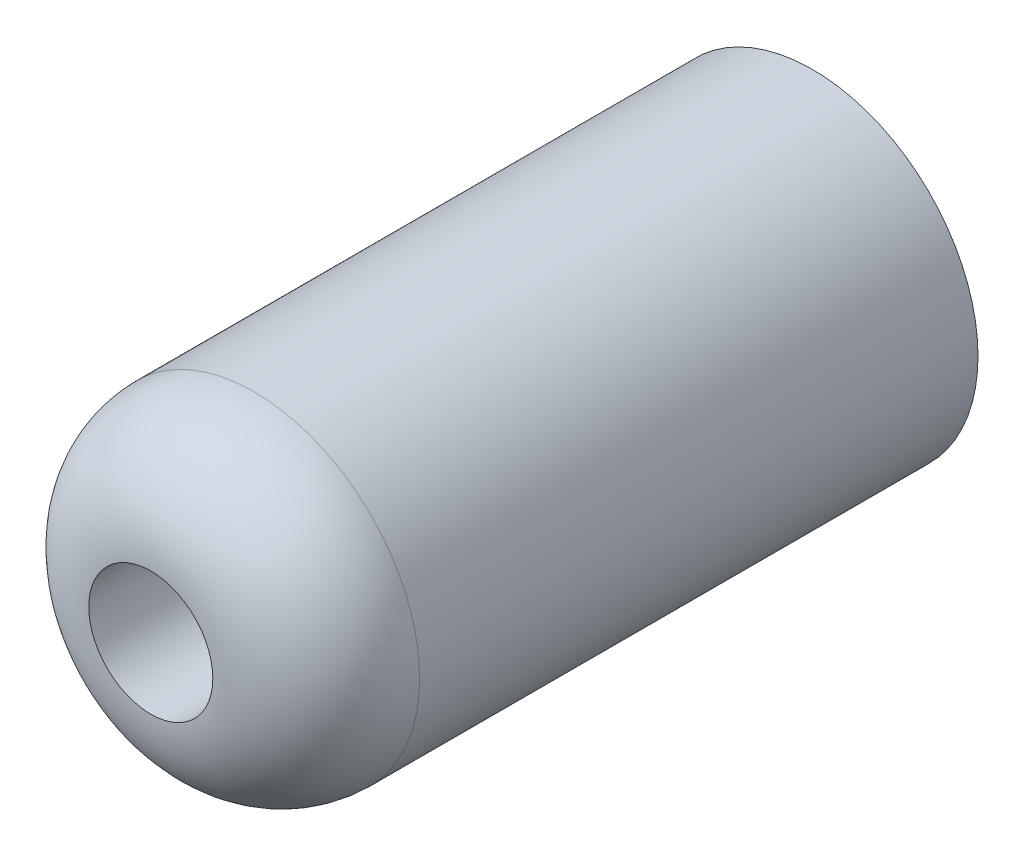
ISO-10303-21;
HEADER;
FILE_DESCRIPTION(('STEP AP214'),'2;1');
FILE_NAME('part.step','',(''),(''),'','','');
FILE_SCHEMA(('AUTOMOTIVE_DESIGN { 1 0 10303 214 1 1 1 1 }'));
ENDSEC;
DATA;
#1=APPLICATION_CONTEXT('core data for automotive mechanical design processes');
#2=APPLICATION_PROTOCOL_DEFINITION('international standard','automotive_design',2000,#1);
#3=PRODUCT_CONTEXT('',#1,'mechanical');
#4=PRODUCT('Part','Part','',(#3));
#5=PRODUCT_RELATED_PRODUCT_CATEGORY('part','',(#4));
#6=PRODUCT_DEFINITION_FORMATION('','',#4);
#7=PRODUCT_DEFINITION_CONTEXT('part definition',#1,'design');
#8=PRODUCT_DEFINITION('design','',#6,#7);
#9=PRODUCT_DEFINITION_SHAPE('','',#8);
#10=(LENGTH_UNIT() NAMED_UNIT(*) SI_UNIT(.MILLI.,.METRE.));
#11=(NAMED_UNIT(*) PLANE_ANGLE_UNIT() SI_UNIT($,.RADIAN.));
#12=(NAMED_UNIT(*) SI_UNIT($,.STERADIAN.) SOLID_ANGLE_UNIT());
#13=UNCERTAINTY_MEASURE_WITH_UNIT(LENGTH_MEASURE(1.E-05),#10,'distance_accuracy_value','');
#14=(GEOMETRIC_REPRESENTATION_CONTEXT(3) GLOBAL_UNCERTAINTY_ASSIGNED_CONTEXT((#13)) GLOBAL_UNIT_ASSIGNED_CONTEXT((#10,
#11,#12)) REPRESENTATION_CONTEXT('',''));
#15=CARTESIAN_POINT('',(0.,0.,0.));
#16=DIRECTION('',(0.,0.,1.));
#17=DIRECTION('',(1.,0.,0.));
#18=AXIS2_PLACEMENT_3D('',#15,#16,#17);
#19=CARTESIAN_POINT('',(0.,0.,11.));
#20=DIRECTION('',(0.,0.,1.));
#21=DIRECTION('',(1.,0.,0.));
#22=AXIS2_PLACEMENT_3D('',#19,#20,#21);
#23=DEGENERATE_TOROIDAL_SURFACE('',#22,3.,5.,.T.);
#24=CARTESIAN_POINT('',(0.,0.,11.));
#25=DIRECTION('',(0.,0.,1.));
#26=DIRECTION('',(1.,0.,0.));
#27=AXIS2_PLACEMENT_3D('',#24,#25,#26);
#28=CIRCLE('',#27,8.);
#29=CARTESIAN_POINT('',(8.,0.,11.));
#30=VERTEX_POINT('',#29);
#31=EDGE_CURVE('E65',#30,#30,#28,.T.);
#32=ORIENTED_EDGE('',*,*,#31,.T.);
#33=EDGE_LOOP('',(#32));
#34=FACE_BOUND('',#33,.T.);
#35=CARTESIAN_POINT('',(0.,0.,16.));
#36=DIRECTION('',(0.,0.,1.));
#37=DIRECTION('',(1.,0.,0.));
#38=AXIS2_PLACEMENT_3D('',#35,#36,#37);
#39=CIRCLE('',#38,2.99999999999997);
#40=CARTESIAN_POINT('',(2.99999999999997,0.,16.));
#41=VERTEX_POINT('',#40);
#42=EDGE_CURVE('E10',#41,#41,#39,.T.);
#43=ORIENTED_EDGE('',*,*,#42,.F.);
#44=EDGE_LOOP('',(#43));
#45=FACE_BOUND('',#44,.T.);
#46=ADVANCED_FACE('F41',(#34,#45),#23,.T.);
#47=CARTESIAN_POINT('',(0.,0.,20.7874015748031));
#48=DIRECTION('',(0.,0.,1.));
#49=DIRECTION('',(1.,0.,0.));
#50=AXIS2_PLACEMENT_3D('',#47,#48,#49);
#51=CYLINDRICAL_SURFACE('',#50,2.99999999999998);
#52=CARTESIAN_POINT('',(0.,0.,11.));
#53=DIRECTION('',(0.,0.,1.));
#54=DIRECTION('',(1.,0.,0.));
#55=AXIS2_PLACEMENT_3D('',#52,#53,#54);
#56=CIRCLE('',#55,2.99999999999999);
#57=CARTESIAN_POINT('',(2.99999999999999,0.,11.));
#58=VERTEX_POINT('',#57);
#59=EDGE_CURVE('E50',#58,#58,#56,.T.);
#60=ORIENTED_EDGE('',*,*,#59,.F.);
#61=EDGE_LOOP('',(#60));
#62=FACE_BOUND('',#61,.T.);
#63=ORIENTED_EDGE('',*,*,#42,.T.);
#64=EDGE_LOOP('',(#63));
#65=FACE_BOUND('',#64,.T.);
#66=ADVANCED_FACE('F83',(#62,#65),#51,.F.);
#67=CARTESIAN_POINT('',(0.,0.,11.));
#68=DIRECTION('',(0.,0.,1.));
#69=DIRECTION('',(1.,0.,0.));
#70=AXIS2_PLACEMENT_3D('',#67,#68,#69);
#71=PLANE('',#70);
#72=CARTESIAN_POINT('',(0.,0.,11.));
#73=DIRECTION('',(0.,0.,1.));
#74=DIRECTION('',(1.,0.,0.));
#75=AXIS2_PLACEMENT_3D('',#72,#73,#74);
#76=CIRCLE('',#75,6.);
#77=CARTESIAN_POINT('',(6.,0.,11.));
#78=VERTEX_POINT('',#77);
#79=EDGE_CURVE('E51',#78,#78,#76,.T.);
#80=ORIENTED_EDGE('',*,*,#79,.F.);
#81=EDGE_LOOP('',(#80));
#82=FACE_BOUND('',#81,.T.);
#83=ORIENTED_EDGE('',*,*,#59,.T.);
#84=EDGE_LOOP('',(#83));
#85=FACE_BOUND('',#84,.T.);
#86=ADVANCED_FACE('F82',(#82,#85),#71,.F.);
#87=CARTESIAN_POINT('',(0.,0.,20.7874015748031));
#88=DIRECTION('',(0.,0.,1.));
#89=DIRECTION('',(1.,0.,0.));
#90=AXIS2_PLACEMENT_3D('',#87,#88,#89);
#91=CYLINDRICAL_SURFACE('',#90,6.);
#92=CARTESIAN_POINT('',(0.,0.,-16.));
#93=DIRECTION('',(0.,0.,1.));
#94=DIRECTION('',(1.,0.,0.));
#95=AXIS2_PLACEMENT_3D('',#92,#93,#94);
#96=CIRCLE('',#95,6.);
#97=CARTESIAN_POINT('',(6.,0.,-16.));
#98=VERTEX_POINT('',#97);
#99=EDGE_CURVE('E54',#98,#98,#96,.T.);
#100=ORIENTED_EDGE('',*,*,#99,.F.);
#101=EDGE_LOOP('',(#100));
#102=FACE_BOUND('',#101,.T.);
#103=ORIENTED_EDGE('',*,*,#79,.T.);
#104=EDGE_LOOP('',(#103));
#105=FACE_BOUND('',#104,.T.);
#106=ADVANCED_FACE('F76',(#102,#105),#91,.F.);
#107=CARTESIAN_POINT('',(0.,0.,-16.));
#108=DIRECTION('',(0.,0.,-1.));
#109=DIRECTION('',(-1.,0.,0.));
#110=AXIS2_PLACEMENT_3D('',#107,#108,#109);
#111=PLANE('',#110);
#112=ORIENTED_EDGE('',*,*,#99,.T.);
#113=EDGE_LOOP('',(#112));
#114=FACE_BOUND('',#113,.T.);
#115=CARTESIAN_POINT('',(0.,0.,-16.));
#116=DIRECTION('',(0.,0.,1.));
#117=DIRECTION('',(1.,0.,0.));
#118=AXIS2_PLACEMENT_3D('',#115,#116,#117);
#119=CIRCLE('',#118,8.);
#120=CARTESIAN_POINT('',(8.,0.,-16.));
#121=VERTEX_POINT('',#120);
#122=EDGE_CURVE('E58',#121,#121,#119,.T.);
#123=ORIENTED_EDGE('',*,*,#122,.F.);
#124=EDGE_LOOP('',(#123));
#125=FACE_BOUND('',#124,.T.);
#126=ADVANCED_FACE('F72',(#114,#125),#111,.T.);
#127=CARTESIAN_POINT('',(0.,0.,20.7874015748031));
#128=DIRECTION('',(0.,0.,1.));
#129=DIRECTION('',(1.,0.,0.));
#130=AXIS2_PLACEMENT_3D('',#127,#128,#129);
#131=CYLINDRICAL_SURFACE('',#130,8.);
#132=ORIENTED_EDGE('',*,*,#122,.T.);
#133=EDGE_LOOP('',(#132));
#134=FACE_BOUND('',#133,.T.);
#135=ORIENTED_EDGE('',*,*,#31,.F.);
#136=EDGE_LOOP('',(#135));
#137=FACE_BOUND('',#136,.T.);
#138=ADVANCED_FACE('F69',(#134,#137),#131,.T.);
#139=CLOSED_SHELL('',(#46,#66,#86,#106,#126,#138));
#140=MANIFOLD_SOLID_BREP('B2',#139);
#141=ADVANCED_BREP_SHAPE_REPRESENTATION('',(#18,#140),#14);
#142=SHAPE_DEFINITION_REPRESENTATION(#9,#141);
ENDSEC;
END-ISO-10303-21;
